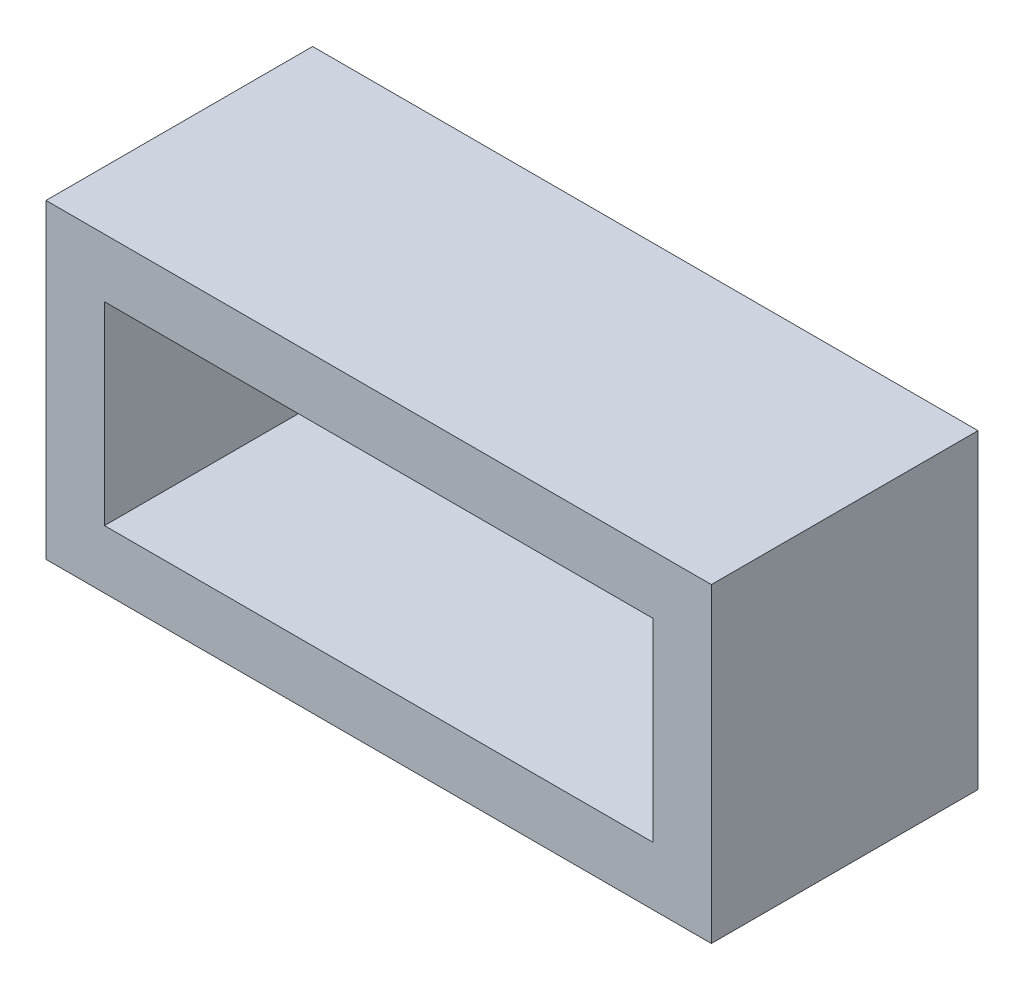
ISO-10303-21;
HEADER;
FILE_DESCRIPTION(('STEP AP214'),'2;1');
FILE_NAME('part.step','',(''),(''),'','','');
FILE_SCHEMA(('AUTOMOTIVE_DESIGN { 1 0 10303 214 1 1 1 1 }'));
ENDSEC;
DATA;
#1=APPLICATION_CONTEXT('core data for automotive mechanical design processes');
#2=APPLICATION_PROTOCOL_DEFINITION('international standard','automotive_design',2000,#1);
#3=PRODUCT_CONTEXT('',#1,'mechanical');
#4=PRODUCT('Part','Part','',(#3));
#5=PRODUCT_RELATED_PRODUCT_CATEGORY('part','',(#4));
#6=PRODUCT_DEFINITION_FORMATION('','',#4);
#7=PRODUCT_DEFINITION_CONTEXT('part definition',#1,'design');
#8=PRODUCT_DEFINITION('design','',#6,#7);
#9=PRODUCT_DEFINITION_SHAPE('','',#8);
#10=(LENGTH_UNIT() NAMED_UNIT(*) SI_UNIT(.MILLI.,.METRE.));
#11=(NAMED_UNIT(*) PLANE_ANGLE_UNIT() SI_UNIT($,.RADIAN.));
#12=(NAMED_UNIT(*) SI_UNIT($,.STERADIAN.) SOLID_ANGLE_UNIT());
#13=UNCERTAINTY_MEASURE_WITH_UNIT(LENGTH_MEASURE(1.E-05),#10,'distance_accuracy_value','');
#14=(GEOMETRIC_REPRESENTATION_CONTEXT(3) GLOBAL_UNCERTAINTY_ASSIGNED_CONTEXT((#13)) GLOBAL_UNIT_ASSIGNED_CONTEXT((#10,
#11,#12)) REPRESENTATION_CONTEXT('',''));
#15=CARTESIAN_POINT('',(0.,0.,0.));
#16=DIRECTION('',(0.,0.,1.));
#17=DIRECTION('',(1.,0.,0.));
#18=AXIS2_PLACEMENT_3D('',#15,#16,#17);
#19=CARTESIAN_POINT('',(0.,0.,8.8));
#20=DIRECTION('',(0.,0.,1.));
#21=DIRECTION('',(1.,0.,0.));
#22=AXIS2_PLACEMENT_3D('',#19,#20,#21);
#23=PLANE('',#22);
#24=DIRECTION('',(0.,-1.,0.));
#25=VECTOR('',#24,1.);
#26=CARTESIAN_POINT('',(-10.8493671858356,4.32351288577803,8.8));
#27=LINE('',#26,#25);
#28=CARTESIAN_POINT('',(-10.8493671858356,4.32351288577803,8.8));
#29=VERTEX_POINT('',#28);
#30=CARTESIAN_POINT('',(-10.8493671858356,-5.93648711422197,8.8));
#31=VERTEX_POINT('',#30);
#32=EDGE_CURVE('E134',#29,#31,#27,.T.);
#33=ORIENTED_EDGE('',*,*,#32,.T.);
#34=DIRECTION('',(1.,0.,0.));
#35=VECTOR('',#34,1.);
#36=CARTESIAN_POINT('',(-10.8493671858356,-5.93648711422197,8.8));
#37=LINE('',#36,#35);
#38=CARTESIAN_POINT('',(11.1106328141644,-5.93648711422197,8.8));
#39=VERTEX_POINT('',#38);
#40=EDGE_CURVE('E137',#31,#39,#37,.T.);
#41=ORIENTED_EDGE('',*,*,#40,.T.);
#42=DIRECTION('',(0.,1.,0.));
#43=VECTOR('',#42,1.);
#44=CARTESIAN_POINT('',(11.1106328141644,4.32351288577803,8.8));
#45=LINE('',#44,#43);
#46=CARTESIAN_POINT('',(11.1106328141644,4.32351288577803,8.8));
#47=VERTEX_POINT('',#46);
#48=EDGE_CURVE('E140',#39,#47,#45,.T.);
#49=ORIENTED_EDGE('',*,*,#48,.T.);
#50=DIRECTION('',(-1.,0.,0.));
#51=VECTOR('',#50,1.);
#52=CARTESIAN_POINT('',(-10.8493671858356,4.32351288577803,8.8));
#53=LINE('',#52,#51);
#54=EDGE_CURVE('E142',#47,#29,#53,.T.);
#55=ORIENTED_EDGE('',*,*,#54,.T.);
#56=EDGE_LOOP('',(#33,#41,#49,#55));
#57=FACE_BOUND('',#56,.T.);
#58=DIRECTION('',(-1.,0.,0.));
#59=VECTOR('',#58,1.);
#60=CARTESIAN_POINT('',(-8.91936718583556,2.39351288577803,8.8));
#61=LINE('',#60,#59);
#62=CARTESIAN_POINT('',(9.18063281416445,2.39351288577803,8.8));
#63=VERTEX_POINT('',#62);
#64=CARTESIAN_POINT('',(-8.91936718583556,2.39351288577803,8.8));
#65=VERTEX_POINT('',#64);
#66=EDGE_CURVE('E106',#63,#65,#61,.T.);
#67=ORIENTED_EDGE('',*,*,#66,.F.);
#68=DIRECTION('',(0.,1.,0.));
#69=VECTOR('',#68,1.);
#70=CARTESIAN_POINT('',(9.18063281416445,2.39351288577803,8.8));
#71=LINE('',#70,#69);
#72=CARTESIAN_POINT('',(9.18063281416445,-4.00648711422197,8.8));
#73=VERTEX_POINT('',#72);
#74=EDGE_CURVE('E98',#73,#63,#71,.T.);
#75=ORIENTED_EDGE('',*,*,#74,.F.);
#76=DIRECTION('',(1.,0.,0.));
#77=VECTOR('',#76,1.);
#78=CARTESIAN_POINT('',(-8.91936718583556,-4.00648711422197,8.8));
#79=LINE('',#78,#77);
#80=CARTESIAN_POINT('',(-8.91936718583556,-4.00648711422197,8.8));
#81=VERTEX_POINT('',#80);
#82=EDGE_CURVE('E120',#81,#73,#79,.T.);
#83=ORIENTED_EDGE('',*,*,#82,.F.);
#84=DIRECTION('',(0.,-1.,0.));
#85=VECTOR('',#84,1.);
#86=CARTESIAN_POINT('',(-8.91936718583556,2.39351288577803,8.8));
#87=LINE('',#86,#85);
#88=EDGE_CURVE('E118',#65,#81,#87,.T.);
#89=ORIENTED_EDGE('',*,*,#88,.F.);
#90=EDGE_LOOP('',(#67,#75,#83,#89));
#91=FACE_BOUND('',#90,.T.);
#92=ADVANCED_FACE('F33',(#57,#91),#23,.T.);
#93=CARTESIAN_POINT('',(0.,0.,0.));
#94=DIRECTION('',(0.,0.,1.));
#95=DIRECTION('',(1.,0.,0.));
#96=AXIS2_PLACEMENT_3D('',#93,#94,#95);
#97=PLANE('',#96);
#98=DIRECTION('',(0.,-1.,0.));
#99=VECTOR('',#98,1.);
#100=CARTESIAN_POINT('',(-10.8493671858356,4.32351288577803,0.));
#101=LINE('',#100,#99);
#102=CARTESIAN_POINT('',(-10.8493671858356,4.32351288577803,0.));
#103=VERTEX_POINT('',#102);
#104=CARTESIAN_POINT('',(-10.8493671858356,-5.93648711422197,0.));
#105=VERTEX_POINT('',#104);
#106=EDGE_CURVE('E114',#103,#105,#101,.T.);
#107=ORIENTED_EDGE('',*,*,#106,.F.);
#108=DIRECTION('',(-1.,0.,0.));
#109=VECTOR('',#108,1.);
#110=CARTESIAN_POINT('',(-10.8493671858356,4.32351288577803,0.));
#111=LINE('',#110,#109);
#112=CARTESIAN_POINT('',(11.1106328141644,4.32351288577803,0.));
#113=VERTEX_POINT('',#112);
#114=EDGE_CURVE('E138',#113,#103,#111,.T.);
#115=ORIENTED_EDGE('',*,*,#114,.F.);
#116=DIRECTION('',(0.,1.,0.));
#117=VECTOR('',#116,1.);
#118=CARTESIAN_POINT('',(11.1106328141644,4.32351288577803,0.));
#119=LINE('',#118,#117);
#120=CARTESIAN_POINT('',(11.1106328141644,-5.93648711422197,0.));
#121=VERTEX_POINT('',#120);
#122=EDGE_CURVE('E149',#121,#113,#119,.T.);
#123=ORIENTED_EDGE('',*,*,#122,.F.);
#124=DIRECTION('',(1.,0.,0.));
#125=VECTOR('',#124,1.);
#126=CARTESIAN_POINT('',(-10.8493671858356,-5.93648711422197,0.));
#127=LINE('',#126,#125);
#128=EDGE_CURVE('E147',#105,#121,#127,.T.);
#129=ORIENTED_EDGE('',*,*,#128,.F.);
#130=EDGE_LOOP('',(#107,#115,#123,#129));
#131=FACE_BOUND('',#130,.T.);
#132=DIRECTION('',(0.,1.,0.));
#133=VECTOR('',#132,1.);
#134=CARTESIAN_POINT('',(9.18063281416445,2.39351288577803,0.));
#135=LINE('',#134,#133);
#136=CARTESIAN_POINT('',(9.18063281416445,-4.00648711422197,0.));
#137=VERTEX_POINT('',#136);
#138=CARTESIAN_POINT('',(9.18063281416445,2.39351288577803,0.));
#139=VERTEX_POINT('',#138);
#140=EDGE_CURVE('E56',#137,#139,#135,.T.);
#141=ORIENTED_EDGE('',*,*,#140,.T.);
#142=DIRECTION('',(-1.,0.,0.));
#143=VECTOR('',#142,1.);
#144=CARTESIAN_POINT('',(-8.91936718583556,2.39351288577803,0.));
#145=LINE('',#144,#143);
#146=CARTESIAN_POINT('',(-8.91936718583556,2.39351288577803,0.));
#147=VERTEX_POINT('',#146);
#148=EDGE_CURVE('E113',#139,#147,#145,.T.);
#149=ORIENTED_EDGE('',*,*,#148,.T.);
#150=DIRECTION('',(0.,-1.,0.));
#151=VECTOR('',#150,1.);
#152=CARTESIAN_POINT('',(-8.91936718583556,2.39351288577803,0.));
#153=LINE('',#152,#151);
#154=CARTESIAN_POINT('',(-8.91936718583556,-4.00648711422197,0.));
#155=VERTEX_POINT('',#154);
#156=EDGE_CURVE('E126',#147,#155,#153,.T.);
#157=ORIENTED_EDGE('',*,*,#156,.T.);
#158=DIRECTION('',(1.,0.,0.));
#159=VECTOR('',#158,1.);
#160=CARTESIAN_POINT('',(-8.91936718583556,-4.00648711422197,0.));
#161=LINE('',#160,#159);
#162=EDGE_CURVE('E107',#155,#137,#161,.T.);
#163=ORIENTED_EDGE('',*,*,#162,.T.);
#164=EDGE_LOOP('',(#141,#149,#157,#163));
#165=FACE_BOUND('',#164,.T.);
#166=ADVANCED_FACE('F167',(#131,#165),#97,.F.);
#167=CARTESIAN_POINT('',(-10.8493671858356,4.32351288577803,8.8));
#168=DIRECTION('',(1.,0.,0.));
#169=DIRECTION('',(0.,0.,-1.));
#170=AXIS2_PLACEMENT_3D('',#167,#168,#169);
#171=PLANE('',#170);
#172=ORIENTED_EDGE('',*,*,#106,.T.);
#173=DIRECTION('',(0.,0.,-1.));
#174=VECTOR('',#173,1.);
#175=CARTESIAN_POINT('',(-10.8493671858356,-5.93648711422197,8.8));
#176=LINE('',#175,#174);
#177=EDGE_CURVE('E11',#31,#105,#176,.T.);
#178=ORIENTED_EDGE('',*,*,#177,.F.);
#179=ORIENTED_EDGE('',*,*,#32,.F.);
#180=DIRECTION('',(0.,0.,-1.));
#181=VECTOR('',#180,1.);
#182=CARTESIAN_POINT('',(-10.8493671858356,4.32351288577803,8.8));
#183=LINE('',#182,#181);
#184=EDGE_CURVE('E144',#29,#103,#183,.T.);
#185=ORIENTED_EDGE('',*,*,#184,.T.);
#186=EDGE_LOOP('',(#172,#178,#179,#185));
#187=FACE_BOUND('',#186,.T.);
#188=ADVANCED_FACE('F35',(#187),#171,.F.);
#189=CARTESIAN_POINT('',(-10.8493671858356,-5.93648711422197,8.8));
#190=DIRECTION('',(0.,1.,0.));
#191=DIRECTION('',(0.,0.,1.));
#192=AXIS2_PLACEMENT_3D('',#189,#190,#191);
#193=PLANE('',#192);
#194=ORIENTED_EDGE('',*,*,#128,.T.);
#195=DIRECTION('',(0.,0.,-1.));
#196=VECTOR('',#195,1.);
#197=CARTESIAN_POINT('',(11.1106328141644,-5.93648711422197,8.8));
#198=LINE('',#197,#196);
#199=EDGE_CURVE('E41',#39,#121,#198,.T.);
#200=ORIENTED_EDGE('',*,*,#199,.F.);
#201=ORIENTED_EDGE('',*,*,#40,.F.);
#202=ORIENTED_EDGE('',*,*,#177,.T.);
#203=EDGE_LOOP('',(#194,#200,#201,#202));
#204=FACE_BOUND('',#203,.T.);
#205=ADVANCED_FACE('F177',(#204),#193,.F.);
#206=CARTESIAN_POINT('',(11.1106328141644,4.32351288577803,8.8));
#207=DIRECTION('',(-1.,0.,0.));
#208=DIRECTION('',(0.,-1.,0.));
#209=AXIS2_PLACEMENT_3D('',#206,#207,#208);
#210=PLANE('',#209);
#211=ORIENTED_EDGE('',*,*,#122,.T.);
#212=DIRECTION('',(0.,0.,-1.));
#213=VECTOR('',#212,1.);
#214=CARTESIAN_POINT('',(11.1106328141644,4.32351288577803,8.8));
#215=LINE('',#214,#213);
#216=EDGE_CURVE('E154',#47,#113,#215,.T.);
#217=ORIENTED_EDGE('',*,*,#216,.F.);
#218=ORIENTED_EDGE('',*,*,#48,.F.);
#219=ORIENTED_EDGE('',*,*,#199,.T.);
#220=EDGE_LOOP('',(#211,#217,#218,#219));
#221=FACE_BOUND('',#220,.T.);
#222=ADVANCED_FACE('F161',(#221),#210,.F.);
#223=CARTESIAN_POINT('',(-10.8493671858356,4.32351288577803,8.8));
#224=DIRECTION('',(0.,-1.,0.));
#225=DIRECTION('',(0.,0.,-1.));
#226=AXIS2_PLACEMENT_3D('',#223,#224,#225);
#227=PLANE('',#226);
#228=ORIENTED_EDGE('',*,*,#114,.T.);
#229=ORIENTED_EDGE('',*,*,#184,.F.);
#230=ORIENTED_EDGE('',*,*,#54,.F.);
#231=ORIENTED_EDGE('',*,*,#216,.T.);
#232=EDGE_LOOP('',(#228,#229,#230,#231));
#233=FACE_BOUND('',#232,.T.);
#234=ADVANCED_FACE('F171',(#233),#227,.F.);
#235=CARTESIAN_POINT('',(9.18063281416445,2.39351288577803,8.8));
#236=DIRECTION('',(-1.,0.,0.));
#237=DIRECTION('',(0.,0.,1.));
#238=AXIS2_PLACEMENT_3D('',#235,#236,#237);
#239=PLANE('',#238);
#240=ORIENTED_EDGE('',*,*,#140,.F.);
#241=DIRECTION('',(0.,0.,-1.));
#242=VECTOR('',#241,1.);
#243=CARTESIAN_POINT('',(9.18063281416445,-4.00648711422197,8.8));
#244=LINE('',#243,#242);
#245=EDGE_CURVE('E102',#73,#137,#244,.T.);
#246=ORIENTED_EDGE('',*,*,#245,.F.);
#247=ORIENTED_EDGE('',*,*,#74,.T.);
#248=DIRECTION('',(0.,0.,-1.));
#249=VECTOR('',#248,1.);
#250=CARTESIAN_POINT('',(9.18063281416445,2.39351288577803,8.8));
#251=LINE('',#250,#249);
#252=EDGE_CURVE('E101',#63,#139,#251,.T.);
#253=ORIENTED_EDGE('',*,*,#252,.T.);
#254=EDGE_LOOP('',(#240,#246,#247,#253));
#255=FACE_BOUND('',#254,.T.);
#256=ADVANCED_FACE('F100',(#255),#239,.T.);
#257=CARTESIAN_POINT('',(-8.91936718583556,2.39351288577803,8.8));
#258=DIRECTION('',(0.,-1.,0.));
#259=DIRECTION('',(0.,0.,-1.));
#260=AXIS2_PLACEMENT_3D('',#257,#258,#259);
#261=PLANE('',#260);
#262=ORIENTED_EDGE('',*,*,#148,.F.);
#263=ORIENTED_EDGE('',*,*,#252,.F.);
#264=ORIENTED_EDGE('',*,*,#66,.T.);
#265=DIRECTION('',(0.,0.,-1.));
#266=VECTOR('',#265,1.);
#267=CARTESIAN_POINT('',(-8.91936718583556,2.39351288577803,8.8));
#268=LINE('',#267,#266);
#269=EDGE_CURVE('E115',#65,#147,#268,.T.);
#270=ORIENTED_EDGE('',*,*,#269,.T.);
#271=EDGE_LOOP('',(#262,#263,#264,#270));
#272=FACE_BOUND('',#271,.T.);
#273=ADVANCED_FACE('F110',(#272),#261,.T.);
#274=CARTESIAN_POINT('',(-8.91936718583556,2.39351288577803,8.8));
#275=DIRECTION('',(1.,0.,0.));
#276=DIRECTION('',(0.,0.,-1.));
#277=AXIS2_PLACEMENT_3D('',#274,#275,#276);
#278=PLANE('',#277);
#279=ORIENTED_EDGE('',*,*,#156,.F.);
#280=ORIENTED_EDGE('',*,*,#269,.F.);
#281=ORIENTED_EDGE('',*,*,#88,.T.);
#282=DIRECTION('',(0.,0.,-1.));
#283=VECTOR('',#282,1.);
#284=CARTESIAN_POINT('',(-8.91936718583556,-4.00648711422197,8.8));
#285=LINE('',#284,#283);
#286=EDGE_CURVE('E48',#81,#155,#285,.T.);
#287=ORIENTED_EDGE('',*,*,#286,.T.);
#288=EDGE_LOOP('',(#279,#280,#281,#287));
#289=FACE_BOUND('',#288,.T.);
#290=ADVANCED_FACE('F200',(#289),#278,.T.);
#291=CARTESIAN_POINT('',(-8.91936718583556,-4.00648711422197,8.8));
#292=DIRECTION('',(0.,1.,0.));
#293=DIRECTION('',(0.,0.,1.));
#294=AXIS2_PLACEMENT_3D('',#291,#292,#293);
#295=PLANE('',#294);
#296=ORIENTED_EDGE('',*,*,#162,.F.);
#297=ORIENTED_EDGE('',*,*,#286,.F.);
#298=ORIENTED_EDGE('',*,*,#82,.T.);
#299=ORIENTED_EDGE('',*,*,#245,.T.);
#300=EDGE_LOOP('',(#296,#297,#298,#299));
#301=FACE_BOUND('',#300,.T.);
#302=ADVANCED_FACE('F204',(#301),#295,.T.);
#303=CLOSED_SHELL('',(#92,#166,#188,#205,#222,#234,#256,#273,#290,#302));
#304=MANIFOLD_SOLID_BREP('B2',#303);
#305=ADVANCED_BREP_SHAPE_REPRESENTATION('',(#18,#304),#14);
#306=SHAPE_DEFINITION_REPRESENTATION(#9,#305);
ENDSEC;
END-ISO-10303-21;
